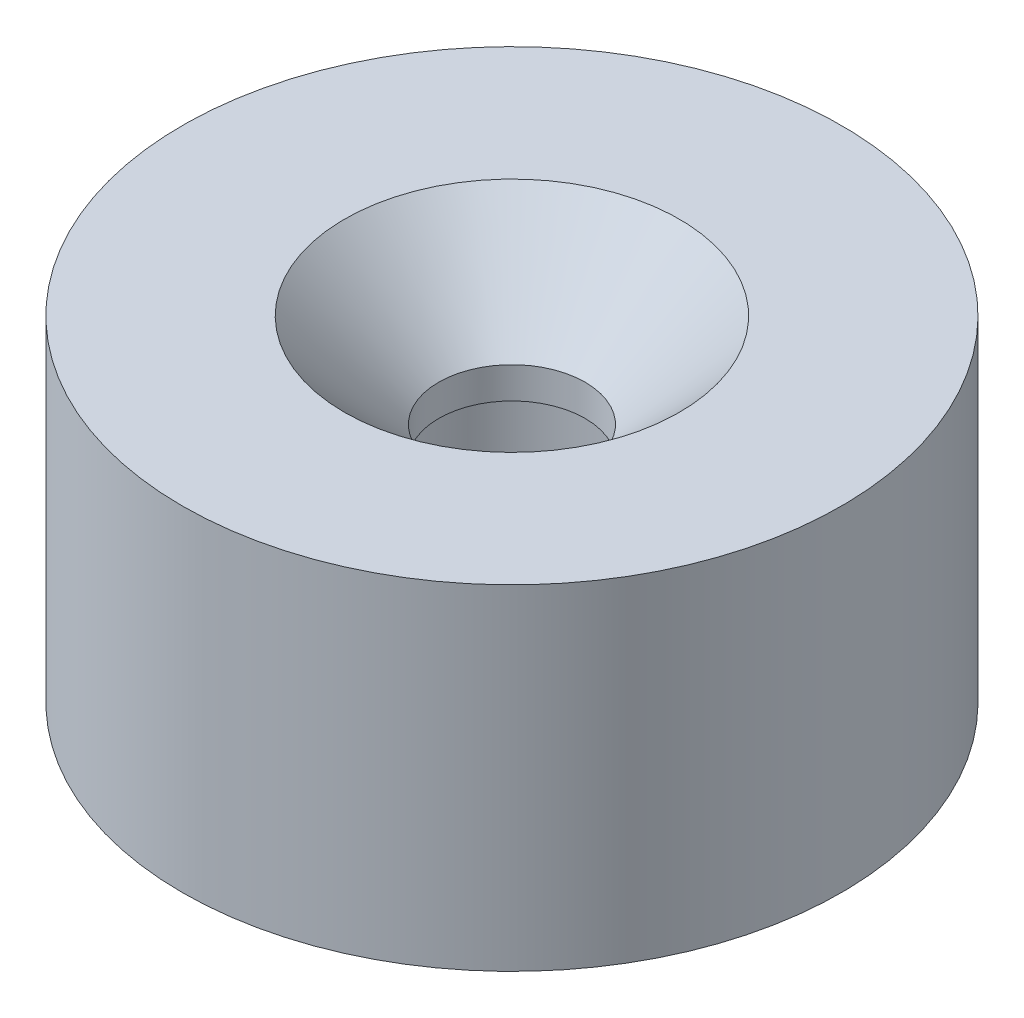
ISO-10303-21;
HEADER;
FILE_DESCRIPTION(('STEP AP214'),'2;1');
FILE_NAME('part.step','',(''),(''),'','','');
FILE_SCHEMA(('AUTOMOTIVE_DESIGN { 1 0 10303 214 1 1 1 1 }'));
ENDSEC;
DATA;
#1=APPLICATION_CONTEXT('core data for automotive mechanical design processes');
#2=APPLICATION_PROTOCOL_DEFINITION('international standard','automotive_design',2000,#1);
#3=PRODUCT_CONTEXT('',#1,'mechanical');
#4=PRODUCT('Part','Part','',(#3));
#5=PRODUCT_RELATED_PRODUCT_CATEGORY('part','',(#4));
#6=PRODUCT_DEFINITION_FORMATION('','',#4);
#7=PRODUCT_DEFINITION_CONTEXT('part definition',#1,'design');
#8=PRODUCT_DEFINITION('design','',#6,#7);
#9=PRODUCT_DEFINITION_SHAPE('','',#8);
#10=(LENGTH_UNIT() NAMED_UNIT(*) SI_UNIT(.MILLI.,.METRE.));
#11=(NAMED_UNIT(*) PLANE_ANGLE_UNIT() SI_UNIT($,.RADIAN.));
#12=(NAMED_UNIT(*) SI_UNIT($,.STERADIAN.) SOLID_ANGLE_UNIT());
#13=UNCERTAINTY_MEASURE_WITH_UNIT(LENGTH_MEASURE(1.E-05),#10,'distance_accuracy_value','');
#14=(GEOMETRIC_REPRESENTATION_CONTEXT(3) GLOBAL_UNCERTAINTY_ASSIGNED_CONTEXT((#13)) GLOBAL_UNIT_ASSIGNED_CONTEXT((#10,
#11,#12)) REPRESENTATION_CONTEXT('',''));
#15=CARTESIAN_POINT('',(0.,0.,0.));
#16=DIRECTION('',(0.,0.,1.));
#17=DIRECTION('',(1.,0.,0.));
#18=AXIS2_PLACEMENT_3D('',#15,#16,#17);
#19=CARTESIAN_POINT('',(0.,5.,0.));
#20=DIRECTION('',(0.,-1.,0.));
#21=DIRECTION('',(0.,0.,-1.));
#22=AXIS2_PLACEMENT_3D('',#19,#20,#21);
#23=PLANE('',#22);
#24=CARTESIAN_POINT('',(0.,5.,0.));
#25=DIRECTION('',(0.,-1.,0.));
#26=DIRECTION('',(0.,0.,-1.));
#27=AXIS2_PLACEMENT_3D('',#24,#25,#26);
#28=CIRCLE('',#27,1.75);
#29=CARTESIAN_POINT('',(0.,5.,-1.75));
#30=VERTEX_POINT('',#29);
#31=EDGE_CURVE('E53',#30,#30,#28,.T.);
#32=ORIENTED_EDGE('',*,*,#31,.F.);
#33=EDGE_LOOP('',(#32));
#34=FACE_BOUND('',#33,.T.);
#35=CARTESIAN_POINT('',(0.,5.,0.));
#36=DIRECTION('',(0.,-1.,0.));
#37=DIRECTION('',(0.,0.,-1.));
#38=AXIS2_PLACEMENT_3D('',#35,#36,#37);
#39=CIRCLE('',#38,2.5);
#40=CARTESIAN_POINT('',(0.,5.,-2.5));
#41=VERTEX_POINT('',#40);
#42=EDGE_CURVE('E10',#41,#41,#39,.F.);
#43=ORIENTED_EDGE('',*,*,#42,.F.);
#44=EDGE_LOOP('',(#43));
#45=FACE_BOUND('',#44,.T.);
#46=ADVANCED_FACE('F30',(#34,#45),#23,.T.);
#47=CARTESIAN_POINT('',(0.,8.,0.));
#48=DIRECTION('',(0.,-1.,0.));
#49=DIRECTION('',(0.,0.,-1.));
#50=AXIS2_PLACEMENT_3D('',#47,#48,#49);
#51=CYLINDRICAL_SURFACE('',#50,1.75);
#52=CARTESIAN_POINT('',(0.,5.75000000000001,0.));
#53=DIRECTION('',(0.,1.,0.));
#54=DIRECTION('',(0.,0.,1.));
#55=AXIS2_PLACEMENT_3D('',#52,#53,#54);
#56=CIRCLE('',#55,1.75);
#57=CARTESIAN_POINT('',(0.,5.75000000000001,1.75));
#58=VERTEX_POINT('',#57);
#59=EDGE_CURVE('E46',#58,#58,#56,.F.);
#60=ORIENTED_EDGE('',*,*,#59,.F.);
#61=EDGE_LOOP('',(#60));
#62=FACE_BOUND('',#61,.T.);
#63=ORIENTED_EDGE('',*,*,#31,.T.);
#64=EDGE_LOOP('',(#63));
#65=FACE_BOUND('',#64,.T.);
#66=ADVANCED_FACE('F87',(#62,#65),#51,.F.);
#67=CARTESIAN_POINT('',(0.,8.,0.));
#68=DIRECTION('',(0.,1.,0.));
#69=DIRECTION('',(0.,0.,1.));
#70=AXIS2_PLACEMENT_3D('',#67,#68,#69);
#71=PLANE('',#70);
#72=CARTESIAN_POINT('',(0.,8.,0.));
#73=DIRECTION('',(0.,1.,0.));
#74=DIRECTION('',(0.,0.,1.));
#75=AXIS2_PLACEMENT_3D('',#72,#73,#74);
#76=CIRCLE('',#75,4.);
#77=CARTESIAN_POINT('',(0.,8.,4.));
#78=VERTEX_POINT('',#77);
#79=EDGE_CURVE('E49',#78,#78,#76,.T.);
#80=ORIENTED_EDGE('',*,*,#79,.F.);
#81=EDGE_LOOP('',(#80));
#82=FACE_BOUND('',#81,.T.);
#83=CARTESIAN_POINT('',(0.,8.,0.));
#84=DIRECTION('',(0.,1.,0.));
#85=DIRECTION('',(0.,0.,1.));
#86=AXIS2_PLACEMENT_3D('',#83,#84,#85);
#87=CIRCLE('',#86,7.875);
#88=CARTESIAN_POINT('',(0.,8.,7.875));
#89=VERTEX_POINT('',#88);
#90=EDGE_CURVE('E37',#89,#89,#87,.T.);
#91=ORIENTED_EDGE('',*,*,#90,.T.);
#92=EDGE_LOOP('',(#91));
#93=FACE_BOUND('',#92,.T.);
#94=ADVANCED_FACE('F92',(#82,#93),#71,.T.);
#95=CARTESIAN_POINT('',(0.,0.,0.));
#96=DIRECTION('',(0.,1.,0.));
#97=DIRECTION('',(0.,0.,1.));
#98=AXIS2_PLACEMENT_3D('',#95,#96,#97);
#99=PLANE('',#98);
#100=CARTESIAN_POINT('',(0.,0.,0.));
#101=DIRECTION('',(0.,-1.,0.));
#102=DIRECTION('',(0.,0.,-1.));
#103=AXIS2_PLACEMENT_3D('',#100,#101,#102);
#104=CIRCLE('',#103,4.);
#105=CARTESIAN_POINT('',(0.,0.,-4.));
#106=VERTEX_POINT('',#105);
#107=EDGE_CURVE('E55',#106,#106,#104,.T.);
#108=ORIENTED_EDGE('',*,*,#107,.F.);
#109=EDGE_LOOP('',(#108));
#110=FACE_BOUND('',#109,.T.);
#111=CARTESIAN_POINT('',(0.,0.,0.));
#112=DIRECTION('',(0.,1.,0.));
#113=DIRECTION('',(0.,0.,1.));
#114=AXIS2_PLACEMENT_3D('',#111,#112,#113);
#115=CIRCLE('',#114,7.875);
#116=CARTESIAN_POINT('',(0.,0.,7.875));
#117=VERTEX_POINT('',#116);
#118=EDGE_CURVE('E41',#117,#117,#115,.T.);
#119=ORIENTED_EDGE('',*,*,#118,.F.);
#120=EDGE_LOOP('',(#119));
#121=FACE_BOUND('',#120,.T.);
#122=ADVANCED_FACE('F101',(#110,#121),#99,.F.);
#123=CARTESIAN_POINT('',(0.,8.,0.));
#124=DIRECTION('',(0.,-1.,0.));
#125=DIRECTION('',(0.,0.,-1.));
#126=AXIS2_PLACEMENT_3D('',#123,#124,#125);
#127=CYLINDRICAL_SURFACE('',#126,7.875);
#128=ORIENTED_EDGE('',*,*,#90,.F.);
#129=EDGE_LOOP('',(#128));
#130=FACE_BOUND('',#129,.T.);
#131=ORIENTED_EDGE('',*,*,#118,.T.);
#132=EDGE_LOOP('',(#131));
#133=FACE_BOUND('',#132,.T.);
#134=ADVANCED_FACE('F32',(#130,#133),#127,.T.);
#135=CARTESIAN_POINT('',(0.,8.,0.));
#136=DIRECTION('',(0.,1.,0.));
#137=DIRECTION('',(0.,0.,1.));
#138=AXIS2_PLACEMENT_3D('',#135,#136,#137);
#139=CONICAL_SURFACE('',#138,4.,0.78539816339745);
#140=ORIENTED_EDGE('',*,*,#59,.T.);
#141=EDGE_LOOP('',(#140));
#142=FACE_BOUND('',#141,.T.);
#143=ORIENTED_EDGE('',*,*,#79,.T.);
#144=EDGE_LOOP('',(#143));
#145=FACE_BOUND('',#144,.T.);
#146=ADVANCED_FACE('F82',(#142,#145),#139,.F.);
#147=CARTESIAN_POINT('',(0.,5.,0.));
#148=DIRECTION('',(0.,-1.,0.));
#149=DIRECTION('',(0.,0.,-1.));
#150=AXIS2_PLACEMENT_3D('',#147,#148,#149);
#151=CYLINDRICAL_SURFACE('',#150,4.);
#152=CARTESIAN_POINT('',(0.,3.,0.));
#153=DIRECTION('',(0.,-1.,0.));
#154=DIRECTION('',(0.,0.,-1.));
#155=AXIS2_PLACEMENT_3D('',#152,#153,#154);
#156=CIRCLE('',#155,4.);
#157=CARTESIAN_POINT('',(0.,3.,-4.));
#158=VERTEX_POINT('',#157);
#159=EDGE_CURVE('E60',#158,#158,#156,.T.);
#160=ORIENTED_EDGE('',*,*,#159,.F.);
#161=EDGE_LOOP('',(#160));
#162=FACE_BOUND('',#161,.T.);
#163=ORIENTED_EDGE('',*,*,#107,.T.);
#164=EDGE_LOOP('',(#163));
#165=FACE_BOUND('',#164,.T.);
#166=ADVANCED_FACE('F74',(#162,#165),#151,.F.);
#167=CARTESIAN_POINT('',(0.,3.,0.));
#168=DIRECTION('',(0.,-1.,0.));
#169=DIRECTION('',(0.,0.,-1.));
#170=AXIS2_PLACEMENT_3D('',#167,#168,#169);
#171=PLANE('',#170);
#172=ORIENTED_EDGE('',*,*,#159,.T.);
#173=EDGE_LOOP('',(#172));
#174=FACE_BOUND('',#173,.T.);
#175=CARTESIAN_POINT('',(0.,3.,0.));
#176=DIRECTION('',(0.,-1.,0.));
#177=DIRECTION('',(0.,0.,-1.));
#178=AXIS2_PLACEMENT_3D('',#175,#176,#177);
#179=CIRCLE('',#178,2.5);
#180=CARTESIAN_POINT('',(0.,3.,-2.5));
#181=VERTEX_POINT('',#180);
#182=EDGE_CURVE('E64',#181,#181,#179,.T.);
#183=ORIENTED_EDGE('',*,*,#182,.F.);
#184=EDGE_LOOP('',(#183));
#185=FACE_BOUND('',#184,.T.);
#186=ADVANCED_FACE('F72',(#174,#185),#171,.T.);
#187=CARTESIAN_POINT('',(0.,3.,0.));
#188=DIRECTION('',(0.,1.,0.));
#189=DIRECTION('',(0.,0.,1.));
#190=AXIS2_PLACEMENT_3D('',#187,#188,#189);
#191=CYLINDRICAL_SURFACE('',#190,2.5);
#192=ORIENTED_EDGE('',*,*,#182,.T.);
#193=EDGE_LOOP('',(#192));
#194=FACE_BOUND('',#193,.T.);
#195=ORIENTED_EDGE('',*,*,#42,.T.);
#196=EDGE_LOOP('',(#195));
#197=FACE_BOUND('',#196,.T.);
#198=ADVANCED_FACE('F70',(#194,#197),#191,.F.);
#199=CLOSED_SHELL('',(#46,#66,#94,#122,#134,#146,#166,#186,#198));
#200=MANIFOLD_SOLID_BREP('B2',#199);
#201=ADVANCED_BREP_SHAPE_REPRESENTATION('',(#18,#200),#14);
#202=SHAPE_DEFINITION_REPRESENTATION(#9,#201);
ENDSEC;
END-ISO-10303-21;
